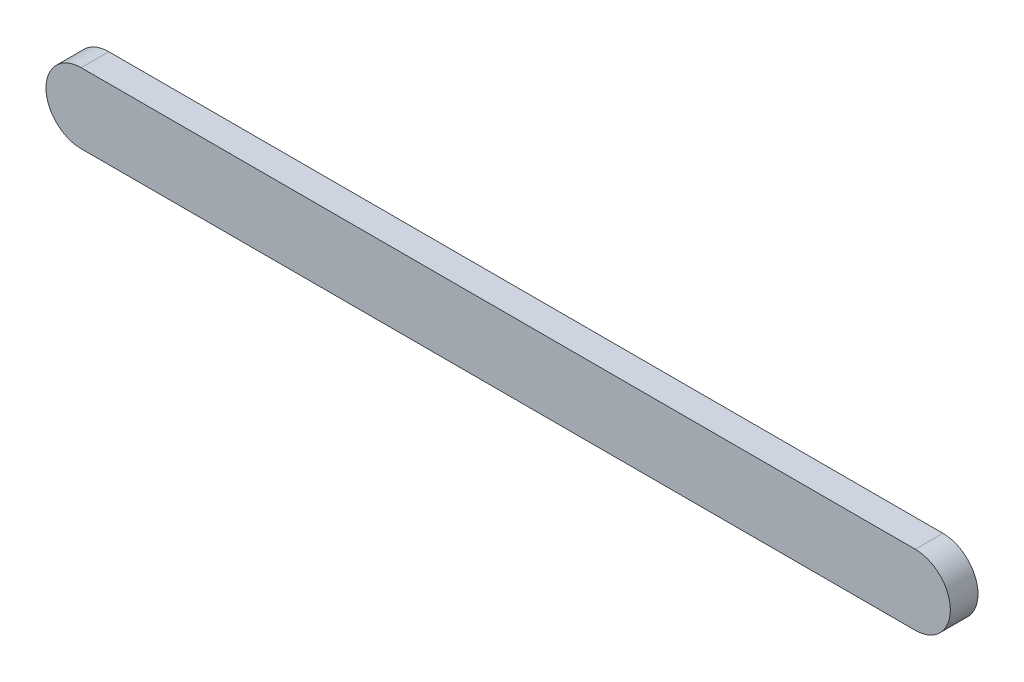
ISO-10303-21;
HEADER;
FILE_DESCRIPTION(('STEP AP214'),'2;1');
FILE_NAME('part.step','',(''),(''),'','','');
FILE_SCHEMA(('AUTOMOTIVE_DESIGN { 1 0 10303 214 1 1 1 1 }'));
ENDSEC;
DATA;
#1=APPLICATION_CONTEXT('core data for automotive mechanical design processes');
#2=APPLICATION_PROTOCOL_DEFINITION('international standard','automotive_design',2000,#1);
#3=PRODUCT_CONTEXT('',#1,'mechanical');
#4=PRODUCT('Part','Part','',(#3));
#5=PRODUCT_RELATED_PRODUCT_CATEGORY('part','',(#4));
#6=PRODUCT_DEFINITION_FORMATION('','',#4);
#7=PRODUCT_DEFINITION_CONTEXT('part definition',#1,'design');
#8=PRODUCT_DEFINITION('design','',#6,#7);
#9=PRODUCT_DEFINITION_SHAPE('','',#8);
#10=(LENGTH_UNIT() NAMED_UNIT(*) SI_UNIT(.MILLI.,.METRE.));
#11=(NAMED_UNIT(*) PLANE_ANGLE_UNIT() SI_UNIT($,.RADIAN.));
#12=(NAMED_UNIT(*) SI_UNIT($,.STERADIAN.) SOLID_ANGLE_UNIT());
#13=UNCERTAINTY_MEASURE_WITH_UNIT(LENGTH_MEASURE(1.E-05),#10,'distance_accuracy_value','');
#14=(GEOMETRIC_REPRESENTATION_CONTEXT(3) GLOBAL_UNCERTAINTY_ASSIGNED_CONTEXT((#13)) GLOBAL_UNIT_ASSIGNED_CONTEXT((#10,
#11,#12)) REPRESENTATION_CONTEXT('',''));
#15=CARTESIAN_POINT('',(0.,0.,0.));
#16=DIRECTION('',(0.,0.,1.));
#17=DIRECTION('',(1.,0.,0.));
#18=AXIS2_PLACEMENT_3D('',#15,#16,#17);
#19=CARTESIAN_POINT('',(107.4531252,53.4924,0.));
#20=DIRECTION('',(0.,1.,0.));
#21=DIRECTION('',(1.,0.,0.));
#22=AXIS2_PLACEMENT_3D('',#19,#20,#21);
#23=PLANE('',#22);
#24=DIRECTION('',(1.,0.,0.));
#25=VECTOR('',#24,1.);
#26=CARTESIAN_POINT('',(107.4531252,53.4924,0.1999996));
#27=LINE('',#26,#25);
#28=CARTESIAN_POINT('',(107.4531252,53.4924,0.1999996));
#29=VERTEX_POINT('',#28);
#30=CARTESIAN_POINT('',(113.4872,53.4924,0.1999996));
#31=VERTEX_POINT('',#30);
#32=EDGE_CURVE('E11',#29,#31,#27,.T.);
#33=ORIENTED_EDGE('',*,*,#32,.F.);
#34=DIRECTION('',(0.,0.,1.));
#35=VECTOR('',#34,1.);
#36=CARTESIAN_POINT('',(107.4531252,53.4924,0.));
#37=LINE('',#36,#35);
#38=CARTESIAN_POINT('',(107.4531252,53.4924,0.));
#39=VERTEX_POINT('',#38);
#40=EDGE_CURVE('E24',#39,#29,#37,.T.);
#41=ORIENTED_EDGE('',*,*,#40,.F.);
#42=DIRECTION('',(1.,0.,0.));
#43=VECTOR('',#42,1.);
#44=CARTESIAN_POINT('',(107.4531252,53.4924,0.));
#45=LINE('',#44,#43);
#46=CARTESIAN_POINT('',(113.4872,53.4924,0.));
#47=VERTEX_POINT('',#46);
#48=EDGE_CURVE('E75',#39,#47,#45,.T.);
#49=ORIENTED_EDGE('',*,*,#48,.T.);
#50=DIRECTION('',(0.,0.,1.));
#51=VECTOR('',#50,1.);
#52=CARTESIAN_POINT('',(113.4872,53.4924,0.));
#53=LINE('',#52,#51);
#54=EDGE_CURVE('E37',#47,#31,#53,.T.);
#55=ORIENTED_EDGE('',*,*,#54,.T.);
#56=EDGE_LOOP('',(#33,#41,#49,#55));
#57=FACE_BOUND('',#56,.T.);
#58=ADVANCED_FACE('F17',(#57),#23,.F.);
#59=CARTESIAN_POINT('',(113.4872,53.7464,0.));
#60=DIRECTION('',(0.,0.,-1.));
#61=DIRECTION('',(0.,-1.,0.));
#62=AXIS2_PLACEMENT_3D('',#59,#60,#61);
#63=CYLINDRICAL_SURFACE('',#62,0.253999999999995);
#64=CARTESIAN_POINT('',(113.4872,53.7464,0.1999996));
#65=DIRECTION('',(0.,0.,1.));
#66=DIRECTION('',(0.,-1.,0.));
#67=AXIS2_PLACEMENT_3D('',#64,#65,#66);
#68=CIRCLE('',#67,0.253999999999995);
#69=CARTESIAN_POINT('',(113.4872,54.0004,0.1999996));
#70=VERTEX_POINT('',#69);
#71=EDGE_CURVE('E83',#31,#70,#68,.T.);
#72=ORIENTED_EDGE('',*,*,#71,.F.);
#73=ORIENTED_EDGE('',*,*,#54,.F.);
#74=CARTESIAN_POINT('',(113.4872,53.7464,0.));
#75=DIRECTION('',(0.,0.,1.));
#76=DIRECTION('',(0.,-1.,0.));
#77=AXIS2_PLACEMENT_3D('',#74,#75,#76);
#78=CIRCLE('',#77,0.253999999999995);
#79=CARTESIAN_POINT('',(113.4872,54.0004,0.));
#80=VERTEX_POINT('',#79);
#81=EDGE_CURVE('E81',#47,#80,#78,.T.);
#82=ORIENTED_EDGE('',*,*,#81,.T.);
#83=DIRECTION('',(0.,0.,1.));
#84=VECTOR('',#83,1.);
#85=CARTESIAN_POINT('',(113.4872,54.0004,0.));
#86=LINE('',#85,#84);
#87=EDGE_CURVE('E67',#80,#70,#86,.T.);
#88=ORIENTED_EDGE('',*,*,#87,.T.);
#89=EDGE_LOOP('',(#72,#73,#82,#88));
#90=FACE_BOUND('',#89,.T.);
#91=ADVANCED_FACE('F89',(#90),#63,.T.);
#92=CARTESIAN_POINT('',(113.4872,54.0004,0.));
#93=DIRECTION('',(0.,-1.,0.));
#94=DIRECTION('',(-1.,0.,0.));
#95=AXIS2_PLACEMENT_3D('',#92,#93,#94);
#96=PLANE('',#95);
#97=DIRECTION('',(-1.,0.,0.));
#98=VECTOR('',#97,1.);
#99=CARTESIAN_POINT('',(113.4872,54.0004,0.1999996));
#100=LINE('',#99,#98);
#101=CARTESIAN_POINT('',(107.4531252,54.0004,0.1999996));
#102=VERTEX_POINT('',#101);
#103=EDGE_CURVE('E71',#70,#102,#100,.T.);
#104=ORIENTED_EDGE('',*,*,#103,.F.);
#105=ORIENTED_EDGE('',*,*,#87,.F.);
#106=DIRECTION('',(-1.,0.,0.));
#107=VECTOR('',#106,1.);
#108=CARTESIAN_POINT('',(113.4872,54.0004,0.));
#109=LINE('',#108,#107);
#110=CARTESIAN_POINT('',(107.4531252,54.0004,0.));
#111=VERTEX_POINT('',#110);
#112=EDGE_CURVE('E63',#80,#111,#109,.T.);
#113=ORIENTED_EDGE('',*,*,#112,.T.);
#114=DIRECTION('',(0.,0.,1.));
#115=VECTOR('',#114,1.);
#116=CARTESIAN_POINT('',(107.4531252,54.0004,0.));
#117=LINE('',#116,#115);
#118=EDGE_CURVE('E53',#111,#102,#117,.T.);
#119=ORIENTED_EDGE('',*,*,#118,.T.);
#120=EDGE_LOOP('',(#104,#105,#113,#119));
#121=FACE_BOUND('',#120,.T.);
#122=ADVANCED_FACE('F66',(#121),#96,.F.);
#123=CARTESIAN_POINT('',(107.4531252,53.7464,0.));
#124=DIRECTION('',(0.,0.,-1.));
#125=DIRECTION('',(0.,1.,0.));
#126=AXIS2_PLACEMENT_3D('',#123,#124,#125);
#127=CYLINDRICAL_SURFACE('',#126,0.253999999999995);
#128=CARTESIAN_POINT('',(107.4531252,53.7464,0.1999996));
#129=DIRECTION('',(0.,0.,1.));
#130=DIRECTION('',(0.,1.,0.));
#131=AXIS2_PLACEMENT_3D('',#128,#129,#130);
#132=CIRCLE('',#131,0.253999999999995);
#133=EDGE_CURVE('E59',#102,#29,#132,.T.);
#134=ORIENTED_EDGE('',*,*,#133,.F.);
#135=ORIENTED_EDGE('',*,*,#118,.F.);
#136=CARTESIAN_POINT('',(107.4531252,53.7464,0.));
#137=DIRECTION('',(0.,0.,1.));
#138=DIRECTION('',(0.,1.,0.));
#139=AXIS2_PLACEMENT_3D('',#136,#137,#138);
#140=CIRCLE('',#139,0.253999999999995);
#141=EDGE_CURVE('E57',#111,#39,#140,.T.);
#142=ORIENTED_EDGE('',*,*,#141,.T.);
#143=ORIENTED_EDGE('',*,*,#40,.T.);
#144=EDGE_LOOP('',(#134,#135,#142,#143));
#145=FACE_BOUND('',#144,.T.);
#146=ADVANCED_FACE('F55',(#145),#127,.T.);
#147=CARTESIAN_POINT('',(107.4531252,53.4924,0.));
#148=DIRECTION('',(0.,0.,-1.));
#149=DIRECTION('',(-1.,0.,0.));
#150=AXIS2_PLACEMENT_3D('',#147,#148,#149);
#151=PLANE('',#150);
#152=ORIENTED_EDGE('',*,*,#141,.F.);
#153=ORIENTED_EDGE('',*,*,#112,.F.);
#154=ORIENTED_EDGE('',*,*,#81,.F.);
#155=ORIENTED_EDGE('',*,*,#48,.F.);
#156=EDGE_LOOP('',(#152,#153,#154,#155));
#157=FACE_BOUND('',#156,.T.);
#158=ADVANCED_FACE('F74',(#157),#151,.T.);
#159=CARTESIAN_POINT('',(107.4531252,53.4924,0.1999996));
#160=DIRECTION('',(0.,0.,-1.));
#161=DIRECTION('',(-1.,0.,0.));
#162=AXIS2_PLACEMENT_3D('',#159,#160,#161);
#163=PLANE('',#162);
#164=ORIENTED_EDGE('',*,*,#32,.T.);
#165=ORIENTED_EDGE('',*,*,#71,.T.);
#166=ORIENTED_EDGE('',*,*,#103,.T.);
#167=ORIENTED_EDGE('',*,*,#133,.T.);
#168=EDGE_LOOP('',(#164,#165,#166,#167));
#169=FACE_BOUND('',#168,.T.);
#170=ADVANCED_FACE('F91',(#169),#163,.F.);
#171=CLOSED_SHELL('',(#58,#91,#122,#146,#158,#170));
#172=MANIFOLD_SOLID_BREP('B1',#171);
#173=ADVANCED_BREP_SHAPE_REPRESENTATION('',(#18,#172),#14);
#174=SHAPE_DEFINITION_REPRESENTATION(#9,#173);
ENDSEC;
END-ISO-10303-21;
